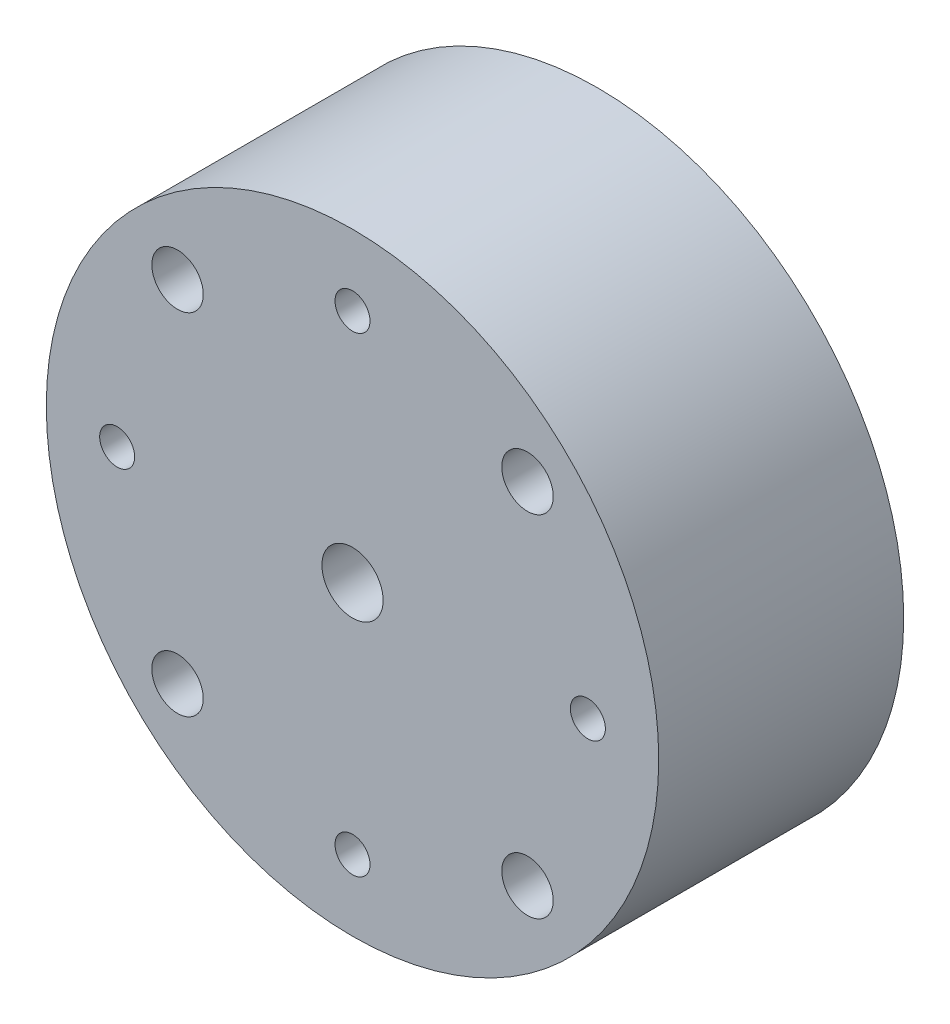
ISO-10303-21;
HEADER;
FILE_DESCRIPTION(('STEP AP214'),'2;1');
FILE_NAME('part.step','',(''),(''),'','','');
FILE_SCHEMA(('AUTOMOTIVE_DESIGN { 1 0 10303 214 1 1 1 1 }'));
ENDSEC;
DATA;
#1=APPLICATION_CONTEXT('core data for automotive mechanical design processes');
#2=APPLICATION_PROTOCOL_DEFINITION('international standard','automotive_design',2000,#1);
#3=PRODUCT_CONTEXT('',#1,'mechanical');
#4=PRODUCT('Part','Part','',(#3));
#5=PRODUCT_RELATED_PRODUCT_CATEGORY('part','',(#4));
#6=PRODUCT_DEFINITION_FORMATION('','',#4);
#7=PRODUCT_DEFINITION_CONTEXT('part definition',#1,'design');
#8=PRODUCT_DEFINITION('design','',#6,#7);
#9=PRODUCT_DEFINITION_SHAPE('','',#8);
#10=(LENGTH_UNIT() NAMED_UNIT(*) SI_UNIT(.MILLI.,.METRE.));
#11=(NAMED_UNIT(*) PLANE_ANGLE_UNIT() SI_UNIT($,.RADIAN.));
#12=(NAMED_UNIT(*) SI_UNIT($,.STERADIAN.) SOLID_ANGLE_UNIT());
#13=UNCERTAINTY_MEASURE_WITH_UNIT(LENGTH_MEASURE(1.E-05),#10,'distance_accuracy_value','');
#14=(GEOMETRIC_REPRESENTATION_CONTEXT(3) GLOBAL_UNCERTAINTY_ASSIGNED_CONTEXT((#13)) GLOBAL_UNIT_ASSIGNED_CONTEXT((#10,
#11,#12)) REPRESENTATION_CONTEXT('',''));
#15=CARTESIAN_POINT('',(0.,0.,0.));
#16=DIRECTION('',(0.,0.,1.));
#17=DIRECTION('',(1.,0.,0.));
#18=AXIS2_PLACEMENT_3D('',#15,#16,#17);
#19=CARTESIAN_POINT('',(0.,0.,14.));
#20=DIRECTION('',(0.,0.,1.));
#21=DIRECTION('',(1.,0.,0.));
#22=AXIS2_PLACEMENT_3D('',#19,#20,#21);
#23=PLANE('',#22);
#24=CARTESIAN_POINT('',(10.,-9.99999999999996,14.));
#25=DIRECTION('',(0.,0.,1.));
#26=DIRECTION('',(0.,1.,0.));
#27=AXIS2_PLACEMENT_3D('',#24,#25,#26);
#28=CIRCLE('',#27,1.47);
#29=CARTESIAN_POINT('',(10.,-8.52999999999996,14.));
#30=VERTEX_POINT('',#29);
#31=EDGE_CURVE('E115',#30,#30,#28,.T.);
#32=ORIENTED_EDGE('',*,*,#31,.F.);
#33=EDGE_LOOP('',(#32));
#34=FACE_BOUND('',#33,.T.);
#35=CARTESIAN_POINT('',(10.,10.,14.));
#36=DIRECTION('',(0.,0.,1.));
#37=DIRECTION('',(-1.,0.,0.));
#38=AXIS2_PLACEMENT_3D('',#35,#36,#37);
#39=CIRCLE('',#38,1.47);
#40=CARTESIAN_POINT('',(8.53,10.,14.));
#41=VERTEX_POINT('',#40);
#42=EDGE_CURVE('E107',#41,#41,#39,.T.);
#43=ORIENTED_EDGE('',*,*,#42,.F.);
#44=EDGE_LOOP('',(#43));
#45=FACE_BOUND('',#44,.T.);
#46=CARTESIAN_POINT('',(-10.0000000000001,9.99999999999989,14.));
#47=DIRECTION('',(0.,0.,1.));
#48=DIRECTION('',(0.,-1.,0.));
#49=AXIS2_PLACEMENT_3D('',#46,#47,#48);
#50=CIRCLE('',#49,1.47);
#51=CARTESIAN_POINT('',(-10.0000000000001,8.52999999999989,14.));
#52=VERTEX_POINT('',#51);
#53=EDGE_CURVE('E99',#52,#52,#50,.T.);
#54=ORIENTED_EDGE('',*,*,#53,.F.);
#55=EDGE_LOOP('',(#54));
#56=FACE_BOUND('',#55,.T.);
#57=CARTESIAN_POINT('',(-10.,-10.,14.));
#58=DIRECTION('',(0.,0.,1.));
#59=DIRECTION('',(1.,0.,0.));
#60=AXIS2_PLACEMENT_3D('',#57,#58,#59);
#61=CIRCLE('',#60,1.47);
#62=CARTESIAN_POINT('',(-8.53,-10.,14.));
#63=VERTEX_POINT('',#62);
#64=EDGE_CURVE('E91',#63,#63,#61,.T.);
#65=ORIENTED_EDGE('',*,*,#64,.F.);
#66=EDGE_LOOP('',(#65));
#67=FACE_BOUND('',#66,.T.);
#68=CARTESIAN_POINT('',(-13.45,0.,14.));
#69=DIRECTION('',(0.,0.,1.));
#70=DIRECTION('',(0.,1.,0.));
#71=AXIS2_PLACEMENT_3D('',#68,#69,#70);
#72=CIRCLE('',#71,1.);
#73=CARTESIAN_POINT('',(-13.45,0.999999999999954,14.));
#74=VERTEX_POINT('',#73);
#75=EDGE_CURVE('E84',#74,#74,#72,.T.);
#76=ORIENTED_EDGE('',*,*,#75,.F.);
#77=EDGE_LOOP('',(#76));
#78=FACE_BOUND('',#77,.T.);
#79=CARTESIAN_POINT('',(0.,-13.45,14.));
#80=DIRECTION('',(0.,0.,1.));
#81=DIRECTION('',(-1.,0.,0.));
#82=AXIS2_PLACEMENT_3D('',#79,#80,#81);
#83=CIRCLE('',#82,1.);
#84=CARTESIAN_POINT('',(-1.,-13.45,14.));
#85=VERTEX_POINT('',#84);
#86=EDGE_CURVE('E76',#85,#85,#83,.T.);
#87=ORIENTED_EDGE('',*,*,#86,.F.);
#88=EDGE_LOOP('',(#87));
#89=FACE_BOUND('',#88,.T.);
#90=CARTESIAN_POINT('',(13.45,1.4088127202232E-13,14.));
#91=DIRECTION('',(0.,0.,1.));
#92=DIRECTION('',(0.,-1.,0.));
#93=AXIS2_PLACEMENT_3D('',#90,#91,#92);
#94=CIRCLE('',#93,1.);
#95=CARTESIAN_POINT('',(13.45,-0.99999999999986,14.));
#96=VERTEX_POINT('',#95);
#97=EDGE_CURVE('E67',#96,#96,#94,.T.);
#98=ORIENTED_EDGE('',*,*,#97,.F.);
#99=EDGE_LOOP('',(#98));
#100=FACE_BOUND('',#99,.T.);
#101=CARTESIAN_POINT('',(0.,13.45,14.));
#102=DIRECTION('',(0.,0.,1.));
#103=DIRECTION('',(1.,0.,0.));
#104=AXIS2_PLACEMENT_3D('',#101,#102,#103);
#105=CIRCLE('',#104,1.);
#106=CARTESIAN_POINT('',(1.,13.45,14.));
#107=VERTEX_POINT('',#106);
#108=EDGE_CURVE('E59',#107,#107,#105,.T.);
#109=ORIENTED_EDGE('',*,*,#108,.F.);
#110=EDGE_LOOP('',(#109));
#111=FACE_BOUND('',#110,.T.);
#112=CARTESIAN_POINT('',(0.,0.,14.));
#113=DIRECTION('',(0.,0.,1.));
#114=DIRECTION('',(1.,0.,0.));
#115=AXIS2_PLACEMENT_3D('',#112,#113,#114);
#116=CIRCLE('',#115,17.5);
#117=CARTESIAN_POINT('',(17.5,0.,14.));
#118=VERTEX_POINT('',#117);
#119=EDGE_CURVE('E10',#118,#118,#116,.T.);
#120=ORIENTED_EDGE('',*,*,#119,.T.);
#121=EDGE_LOOP('',(#120));
#122=FACE_BOUND('',#121,.T.);
#123=CARTESIAN_POINT('',(0.,0.,14.));
#124=DIRECTION('',(0.,0.,1.));
#125=DIRECTION('',(1.,0.,0.));
#126=AXIS2_PLACEMENT_3D('',#123,#124,#125);
#127=CIRCLE('',#126,1.75);
#128=CARTESIAN_POINT('',(1.75,0.,14.));
#129=VERTEX_POINT('',#128);
#130=EDGE_CURVE('E49',#129,#129,#127,.T.);
#131=ORIENTED_EDGE('',*,*,#130,.F.);
#132=EDGE_LOOP('',(#131));
#133=FACE_BOUND('',#132,.T.);
#134=ADVANCED_FACE('F36',(#34,#45,#56,#67,#78,#89,#100,#111,#122,#133),#23,.T.);
#135=CARTESIAN_POINT('',(0.,0.,0.));
#136=DIRECTION('',(0.,0.,1.));
#137=DIRECTION('',(1.,0.,0.));
#138=AXIS2_PLACEMENT_3D('',#135,#136,#137);
#139=PLANE('',#138);
#140=CARTESIAN_POINT('',(10.,-9.99999999999996,0.));
#141=DIRECTION('',(0.,0.,1.));
#142=DIRECTION('',(0.,1.,0.));
#143=AXIS2_PLACEMENT_3D('',#140,#141,#142);
#144=CIRCLE('',#143,1.47);
#145=CARTESIAN_POINT('',(10.,-8.52999999999996,0.));
#146=VERTEX_POINT('',#145);
#147=EDGE_CURVE('E95',#146,#146,#144,.T.);
#148=ORIENTED_EDGE('',*,*,#147,.T.);
#149=EDGE_LOOP('',(#148));
#150=FACE_BOUND('',#149,.T.);
#151=CARTESIAN_POINT('',(10.,10.,0.));
#152=DIRECTION('',(0.,0.,1.));
#153=DIRECTION('',(-1.,0.,0.));
#154=AXIS2_PLACEMENT_3D('',#151,#152,#153);
#155=CIRCLE('',#154,1.47);
#156=CARTESIAN_POINT('',(8.53,10.,0.));
#157=VERTEX_POINT('',#156);
#158=EDGE_CURVE('E111',#157,#157,#155,.T.);
#159=ORIENTED_EDGE('',*,*,#158,.T.);
#160=EDGE_LOOP('',(#159));
#161=FACE_BOUND('',#160,.T.);
#162=CARTESIAN_POINT('',(-10.0000000000001,9.99999999999989,0.));
#163=DIRECTION('',(0.,0.,1.));
#164=DIRECTION('',(0.,-1.,0.));
#165=AXIS2_PLACEMENT_3D('',#162,#163,#164);
#166=CIRCLE('',#165,1.47);
#167=CARTESIAN_POINT('',(-10.0000000000001,8.52999999999989,0.));
#168=VERTEX_POINT('',#167);
#169=EDGE_CURVE('E103',#168,#168,#166,.T.);
#170=ORIENTED_EDGE('',*,*,#169,.T.);
#171=EDGE_LOOP('',(#170));
#172=FACE_BOUND('',#171,.T.);
#173=CARTESIAN_POINT('',(-10.,-10.,0.));
#174=DIRECTION('',(0.,0.,1.));
#175=DIRECTION('',(1.,0.,0.));
#176=AXIS2_PLACEMENT_3D('',#173,#174,#175);
#177=CIRCLE('',#176,1.47);
#178=CARTESIAN_POINT('',(-8.53,-10.,0.));
#179=VERTEX_POINT('',#178);
#180=EDGE_CURVE('E72',#179,#179,#177,.T.);
#181=ORIENTED_EDGE('',*,*,#180,.T.);
#182=EDGE_LOOP('',(#181));
#183=FACE_BOUND('',#182,.T.);
#184=CARTESIAN_POINT('',(-13.45,0.,0.));
#185=DIRECTION('',(0.,0.,1.));
#186=DIRECTION('',(0.,1.,0.));
#187=AXIS2_PLACEMENT_3D('',#184,#185,#186);
#188=CIRCLE('',#187,1.);
#189=CARTESIAN_POINT('',(-13.45,0.999999999999954,0.));
#190=VERTEX_POINT('',#189);
#191=EDGE_CURVE('E63',#190,#190,#188,.T.);
#192=ORIENTED_EDGE('',*,*,#191,.T.);
#193=EDGE_LOOP('',(#192));
#194=FACE_BOUND('',#193,.T.);
#195=CARTESIAN_POINT('',(0.,-13.45,0.));
#196=DIRECTION('',(0.,0.,1.));
#197=DIRECTION('',(-1.,0.,0.));
#198=AXIS2_PLACEMENT_3D('',#195,#196,#197);
#199=CIRCLE('',#198,1.);
#200=CARTESIAN_POINT('',(-1.,-13.45,0.));
#201=VERTEX_POINT('',#200);
#202=EDGE_CURVE('E80',#201,#201,#199,.T.);
#203=ORIENTED_EDGE('',*,*,#202,.T.);
#204=EDGE_LOOP('',(#203));
#205=FACE_BOUND('',#204,.T.);
#206=CARTESIAN_POINT('',(13.45,1.4088127202232E-13,0.));
#207=DIRECTION('',(0.,0.,1.));
#208=DIRECTION('',(0.,-1.,0.));
#209=AXIS2_PLACEMENT_3D('',#206,#207,#208);
#210=CIRCLE('',#209,1.);
#211=CARTESIAN_POINT('',(13.45,-0.99999999999986,0.));
#212=VERTEX_POINT('',#211);
#213=EDGE_CURVE('E71',#212,#212,#210,.T.);
#214=ORIENTED_EDGE('',*,*,#213,.T.);
#215=EDGE_LOOP('',(#214));
#216=FACE_BOUND('',#215,.T.);
#217=CARTESIAN_POINT('',(0.,13.45,0.));
#218=DIRECTION('',(0.,0.,1.));
#219=DIRECTION('',(1.,0.,0.));
#220=AXIS2_PLACEMENT_3D('',#217,#218,#219);
#221=CIRCLE('',#220,1.);
#222=CARTESIAN_POINT('',(1.,13.45,0.));
#223=VERTEX_POINT('',#222);
#224=EDGE_CURVE('E55',#223,#223,#221,.T.);
#225=ORIENTED_EDGE('',*,*,#224,.T.);
#226=EDGE_LOOP('',(#225));
#227=FACE_BOUND('',#226,.T.);
#228=CARTESIAN_POINT('',(0.,0.,0.));
#229=DIRECTION('',(0.,0.,1.));
#230=DIRECTION('',(1.,0.,0.));
#231=AXIS2_PLACEMENT_3D('',#228,#229,#230);
#232=CIRCLE('',#231,17.5);
#233=CARTESIAN_POINT('',(17.5,0.,0.));
#234=VERTEX_POINT('',#233);
#235=EDGE_CURVE('E40',#234,#234,#232,.T.);
#236=ORIENTED_EDGE('',*,*,#235,.F.);
#237=EDGE_LOOP('',(#236));
#238=FACE_BOUND('',#237,.T.);
#239=CARTESIAN_POINT('',(0.,0.,0.));
#240=DIRECTION('',(0.,0.,1.));
#241=DIRECTION('',(1.,0.,0.));
#242=AXIS2_PLACEMENT_3D('',#239,#240,#241);
#243=CIRCLE('',#242,1.75);
#244=CARTESIAN_POINT('',(1.75,0.,0.));
#245=VERTEX_POINT('',#244);
#246=EDGE_CURVE('E51',#245,#245,#243,.T.);
#247=ORIENTED_EDGE('',*,*,#246,.T.);
#248=EDGE_LOOP('',(#247));
#249=FACE_BOUND('',#248,.T.);
#250=ADVANCED_FACE('F123',(#150,#161,#172,#183,#194,#205,#216,#227,#238,#249),#139,.F.);
#251=CARTESIAN_POINT('',(0.,0.,14.));
#252=DIRECTION('',(0.,0.,-1.));
#253=DIRECTION('',(-1.,0.,0.));
#254=AXIS2_PLACEMENT_3D('',#251,#252,#253);
#255=CYLINDRICAL_SURFACE('',#254,17.5);
#256=ORIENTED_EDGE('',*,*,#119,.F.);
#257=EDGE_LOOP('',(#256));
#258=FACE_BOUND('',#257,.T.);
#259=ORIENTED_EDGE('',*,*,#235,.T.);
#260=EDGE_LOOP('',(#259));
#261=FACE_BOUND('',#260,.T.);
#262=ADVANCED_FACE('F38',(#258,#261),#255,.T.);
#263=CARTESIAN_POINT('',(0.,0.,14.));
#264=DIRECTION('',(0.,0.,-1.));
#265=DIRECTION('',(-1.,0.,0.));
#266=AXIS2_PLACEMENT_3D('',#263,#264,#265);
#267=CYLINDRICAL_SURFACE('',#266,1.75);
#268=ORIENTED_EDGE('',*,*,#130,.T.);
#269=EDGE_LOOP('',(#268));
#270=FACE_BOUND('',#269,.T.);
#271=ORIENTED_EDGE('',*,*,#246,.F.);
#272=EDGE_LOOP('',(#271));
#273=FACE_BOUND('',#272,.T.);
#274=ADVANCED_FACE('F152',(#270,#273),#267,.F.);
#275=CARTESIAN_POINT('',(0.,13.45,0.));
#276=DIRECTION('',(0.,0.,1.));
#277=DIRECTION('',(1.,0.,0.));
#278=AXIS2_PLACEMENT_3D('',#275,#276,#277);
#279=CYLINDRICAL_SURFACE('',#278,1.);
#280=ORIENTED_EDGE('',*,*,#224,.F.);
#281=EDGE_LOOP('',(#280));
#282=FACE_BOUND('',#281,.T.);
#283=ORIENTED_EDGE('',*,*,#108,.T.);
#284=EDGE_LOOP('',(#283));
#285=FACE_BOUND('',#284,.T.);
#286=ADVANCED_FACE('F155',(#282,#285),#279,.F.);
#287=CARTESIAN_POINT('',(13.45,1.4088127202232E-13,0.));
#288=DIRECTION('',(0.,0.,1.));
#289=DIRECTION('',(1.,0.,0.));
#290=AXIS2_PLACEMENT_3D('',#287,#288,#289);
#291=CYLINDRICAL_SURFACE('',#290,1.);
#292=ORIENTED_EDGE('',*,*,#213,.F.);
#293=EDGE_LOOP('',(#292));
#294=FACE_BOUND('',#293,.T.);
#295=ORIENTED_EDGE('',*,*,#97,.T.);
#296=EDGE_LOOP('',(#295));
#297=FACE_BOUND('',#296,.T.);
#298=ADVANCED_FACE('F167',(#294,#297),#291,.F.);
#299=CARTESIAN_POINT('',(0.,-13.45,0.));
#300=DIRECTION('',(0.,0.,1.));
#301=DIRECTION('',(1.,0.,0.));
#302=AXIS2_PLACEMENT_3D('',#299,#300,#301);
#303=CYLINDRICAL_SURFACE('',#302,1.);
#304=ORIENTED_EDGE('',*,*,#202,.F.);
#305=EDGE_LOOP('',(#304));
#306=FACE_BOUND('',#305,.T.);
#307=ORIENTED_EDGE('',*,*,#86,.T.);
#308=EDGE_LOOP('',(#307));
#309=FACE_BOUND('',#308,.T.);
#310=ADVANCED_FACE('F171',(#306,#309),#303,.F.);
#311=CARTESIAN_POINT('',(-13.45,0.,0.));
#312=DIRECTION('',(0.,0.,1.));
#313=DIRECTION('',(1.,0.,0.));
#314=AXIS2_PLACEMENT_3D('',#311,#312,#313);
#315=CYLINDRICAL_SURFACE('',#314,1.);
#316=ORIENTED_EDGE('',*,*,#191,.F.);
#317=EDGE_LOOP('',(#316));
#318=FACE_BOUND('',#317,.T.);
#319=ORIENTED_EDGE('',*,*,#75,.T.);
#320=EDGE_LOOP('',(#319));
#321=FACE_BOUND('',#320,.T.);
#322=ADVANCED_FACE('F175',(#318,#321),#315,.F.);
#323=CARTESIAN_POINT('',(-10.,-10.,0.));
#324=DIRECTION('',(0.,0.,1.));
#325=DIRECTION('',(1.,0.,0.));
#326=AXIS2_PLACEMENT_3D('',#323,#324,#325);
#327=CYLINDRICAL_SURFACE('',#326,1.47);
#328=ORIENTED_EDGE('',*,*,#180,.F.);
#329=EDGE_LOOP('',(#328));
#330=FACE_BOUND('',#329,.T.);
#331=ORIENTED_EDGE('',*,*,#64,.T.);
#332=EDGE_LOOP('',(#331));
#333=FACE_BOUND('',#332,.T.);
#334=ADVANCED_FACE('F179',(#330,#333),#327,.F.);
#335=CARTESIAN_POINT('',(-10.0000000000001,9.99999999999989,0.));
#336=DIRECTION('',(0.,0.,1.));
#337=DIRECTION('',(1.,0.,0.));
#338=AXIS2_PLACEMENT_3D('',#335,#336,#337);
#339=CYLINDRICAL_SURFACE('',#338,1.47);
#340=ORIENTED_EDGE('',*,*,#169,.F.);
#341=EDGE_LOOP('',(#340));
#342=FACE_BOUND('',#341,.T.);
#343=ORIENTED_EDGE('',*,*,#53,.T.);
#344=EDGE_LOOP('',(#343));
#345=FACE_BOUND('',#344,.T.);
#346=ADVANCED_FACE('F183',(#342,#345),#339,.F.);
#347=CARTESIAN_POINT('',(10.,10.,0.));
#348=DIRECTION('',(0.,0.,1.));
#349=DIRECTION('',(1.,0.,0.));
#350=AXIS2_PLACEMENT_3D('',#347,#348,#349);
#351=CYLINDRICAL_SURFACE('',#350,1.47);
#352=ORIENTED_EDGE('',*,*,#158,.F.);
#353=EDGE_LOOP('',(#352));
#354=FACE_BOUND('',#353,.T.);
#355=ORIENTED_EDGE('',*,*,#42,.T.);
#356=EDGE_LOOP('',(#355));
#357=FACE_BOUND('',#356,.T.);
#358=ADVANCED_FACE('F129',(#354,#357),#351,.F.);
#359=CARTESIAN_POINT('',(10.,-9.99999999999996,0.));
#360=DIRECTION('',(0.,0.,1.));
#361=DIRECTION('',(1.,0.,0.));
#362=AXIS2_PLACEMENT_3D('',#359,#360,#361);
#363=CYLINDRICAL_SURFACE('',#362,1.47);
#364=ORIENTED_EDGE('',*,*,#147,.F.);
#365=EDGE_LOOP('',(#364));
#366=FACE_BOUND('',#365,.T.);
#367=ORIENTED_EDGE('',*,*,#31,.T.);
#368=EDGE_LOOP('',(#367));
#369=FACE_BOUND('',#368,.T.);
#370=ADVANCED_FACE('F126',(#366,#369),#363,.F.);
#371=CLOSED_SHELL('',(#134,#250,#262,#274,#286,#298,#310,#322,#334,#346,#358,#370));
#372=MANIFOLD_SOLID_BREP('B2',#371);
#373=ADVANCED_BREP_SHAPE_REPRESENTATION('',(#18,#372),#14);
#374=SHAPE_DEFINITION_REPRESENTATION(#9,#373);
ENDSEC;
END-ISO-10303-21;
